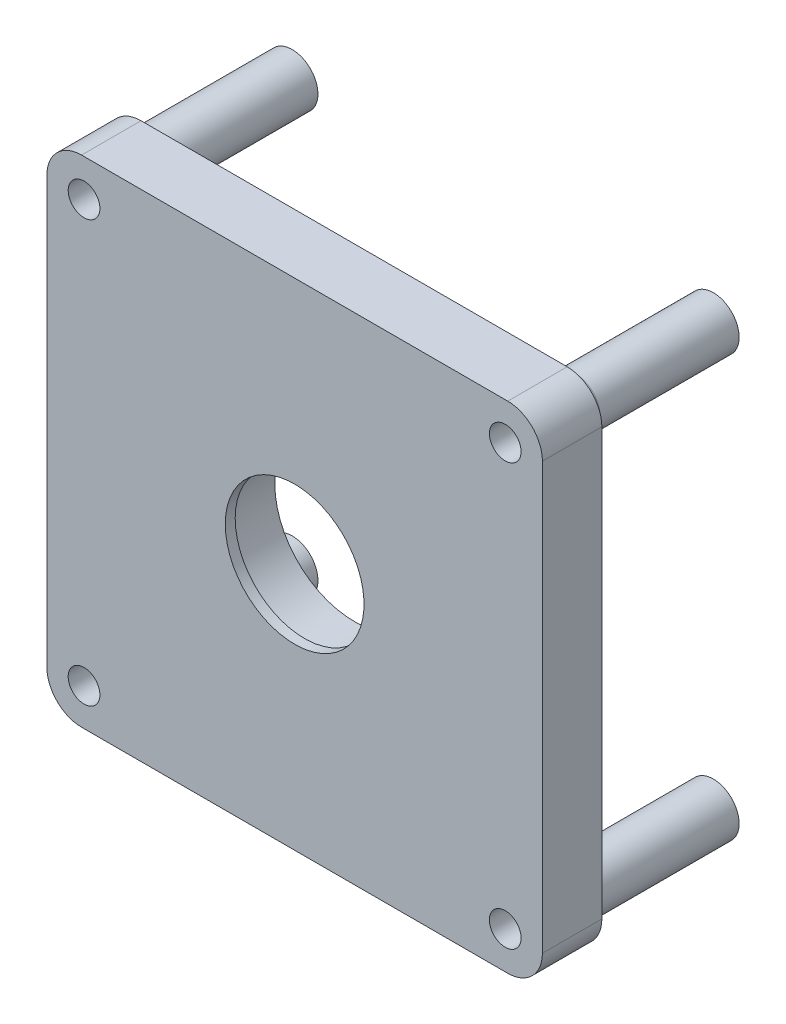
ISO-10303-21;
HEADER;
FILE_DESCRIPTION(('STEP AP214'),'2;1');
FILE_NAME('part.step','',(''),(''),'','','');
FILE_SCHEMA(('AUTOMOTIVE_DESIGN { 1 0 10303 214 1 1 1 1 }'));
ENDSEC;
DATA;
#1=APPLICATION_CONTEXT('core data for automotive mechanical design processes');
#2=APPLICATION_PROTOCOL_DEFINITION('international standard','automotive_design',2000,#1);
#3=PRODUCT_CONTEXT('',#1,'mechanical');
#4=PRODUCT('Part','Part','',(#3));
#5=PRODUCT_RELATED_PRODUCT_CATEGORY('part','',(#4));
#6=PRODUCT_DEFINITION_FORMATION('','',#4);
#7=PRODUCT_DEFINITION_CONTEXT('part definition',#1,'design');
#8=PRODUCT_DEFINITION('design','',#6,#7);
#9=PRODUCT_DEFINITION_SHAPE('','',#8);
#10=(LENGTH_UNIT() NAMED_UNIT(*) SI_UNIT(.MILLI.,.METRE.));
#11=(NAMED_UNIT(*) PLANE_ANGLE_UNIT() SI_UNIT($,.RADIAN.));
#12=(NAMED_UNIT(*) SI_UNIT($,.STERADIAN.) SOLID_ANGLE_UNIT());
#13=UNCERTAINTY_MEASURE_WITH_UNIT(LENGTH_MEASURE(1.E-05),#10,'distance_accuracy_value','');
#14=(GEOMETRIC_REPRESENTATION_CONTEXT(3) GLOBAL_UNCERTAINTY_ASSIGNED_CONTEXT((#13)) GLOBAL_UNIT_ASSIGNED_CONTEXT((#10,
#11,#12)) REPRESENTATION_CONTEXT('',''));
#15=CARTESIAN_POINT('',(0.,0.,0.));
#16=DIRECTION('',(0.,0.,1.));
#17=DIRECTION('',(1.,0.,0.));
#18=AXIS2_PLACEMENT_3D('',#15,#16,#17);
#19=CARTESIAN_POINT('',(0.,0.,0.));
#20=DIRECTION('',(0.,0.,-1.));
#21=DIRECTION('',(-1.,0.,0.));
#22=AXIS2_PLACEMENT_3D('',#19,#20,#21);
#23=PLANE('',#22);
#24=CARTESIAN_POINT('',(-42.5000000000001,42.4999999999999,0.));
#25=DIRECTION('',(0.,0.,-1.));
#26=DIRECTION('',(-1.,0.,0.));
#27=AXIS2_PLACEMENT_3D('',#24,#25,#26);
#28=CIRCLE('',#27,7.2);
#29=CARTESIAN_POINT('',(-49.7000000000001,42.4999999999999,0.));
#30=VERTEX_POINT('',#29);
#31=EDGE_CURVE('E153',#30,#30,#28,.F.);
#32=ORIENTED_EDGE('',*,*,#31,.T.);
#33=EDGE_LOOP('',(#32));
#34=FACE_BOUND('',#33,.T.);
#35=CARTESIAN_POINT('',(-42.5,-42.5,0.));
#36=DIRECTION('',(0.,0.,-1.));
#37=DIRECTION('',(-1.,0.,0.));
#38=AXIS2_PLACEMENT_3D('',#35,#36,#37);
#39=CIRCLE('',#38,7.2);
#40=CARTESIAN_POINT('',(-49.7,-42.5,0.));
#41=VERTEX_POINT('',#40);
#42=EDGE_CURVE('E150',#41,#41,#39,.F.);
#43=ORIENTED_EDGE('',*,*,#42,.T.);
#44=EDGE_LOOP('',(#43));
#45=FACE_BOUND('',#44,.T.);
#46=CARTESIAN_POINT('',(42.5000000000004,-42.4999999999996,0.));
#47=DIRECTION('',(0.,0.,-1.));
#48=DIRECTION('',(-1.,0.,0.));
#49=AXIS2_PLACEMENT_3D('',#46,#47,#48);
#50=CIRCLE('',#49,7.2);
#51=CARTESIAN_POINT('',(35.3000000000005,-42.4999999999996,0.));
#52=VERTEX_POINT('',#51);
#53=EDGE_CURVE('E147',#52,#52,#50,.F.);
#54=ORIENTED_EDGE('',*,*,#53,.T.);
#55=EDGE_LOOP('',(#54));
#56=FACE_BOUND('',#55,.T.);
#57=CARTESIAN_POINT('',(42.5,42.5,0.));
#58=DIRECTION('',(0.,0.,-1.));
#59=DIRECTION('',(-1.,0.,0.));
#60=AXIS2_PLACEMENT_3D('',#57,#58,#59);
#61=CIRCLE('',#60,7.2);
#62=CARTESIAN_POINT('',(35.3,42.5,0.));
#63=VERTEX_POINT('',#62);
#64=EDGE_CURVE('E144',#63,#63,#61,.F.);
#65=ORIENTED_EDGE('',*,*,#64,.T.);
#66=EDGE_LOOP('',(#65));
#67=FACE_BOUND('',#66,.T.);
#68=CARTESIAN_POINT('',(0.,0.,0.));
#69=DIRECTION('',(0.,0.,-1.));
#70=DIRECTION('',(-1.,0.,0.));
#71=AXIS2_PLACEMENT_3D('',#68,#69,#70);
#72=CIRCLE('',#71,16.);
#73=CARTESIAN_POINT('',(-16.,0.,0.));
#74=VERTEX_POINT('',#73);
#75=EDGE_CURVE('E197',#74,#74,#72,.T.);
#76=ORIENTED_EDGE('',*,*,#75,.F.);
#77=EDGE_LOOP('',(#76));
#78=FACE_BOUND('',#77,.T.);
#79=DIRECTION('',(1.,0.,0.));
#80=VECTOR('',#79,1.);
#81=CARTESIAN_POINT('',(-50.,-50.,0.));
#82=LINE('',#81,#80);
#83=CARTESIAN_POINT('',(-43.,-50.,0.));
#84=VERTEX_POINT('',#83);
#85=CARTESIAN_POINT('',(43.,-50.,0.));
#86=VERTEX_POINT('',#85);
#87=EDGE_CURVE('E119',#84,#86,#82,.T.);
#88=ORIENTED_EDGE('',*,*,#87,.F.);
#89=CARTESIAN_POINT('',(-43.,-43.,0.));
#90=DIRECTION('',(0.,0.,-1.));
#91=DIRECTION('',(-1.,0.,0.));
#92=AXIS2_PLACEMENT_3D('',#89,#90,#91);
#93=CIRCLE('',#92,7.);
#94=CARTESIAN_POINT('',(-50.,-43.,0.));
#95=VERTEX_POINT('',#94);
#96=EDGE_CURVE('E102',#84,#95,#93,.T.);
#97=ORIENTED_EDGE('',*,*,#96,.T.);
#98=DIRECTION('',(0.,-1.,0.));
#99=VECTOR('',#98,1.);
#100=CARTESIAN_POINT('',(-50.,-50.,0.));
#101=LINE('',#100,#99);
#102=CARTESIAN_POINT('',(-50.,43.,0.));
#103=VERTEX_POINT('',#102);
#104=EDGE_CURVE('E128',#103,#95,#101,.T.);
#105=ORIENTED_EDGE('',*,*,#104,.F.);
#106=CARTESIAN_POINT('',(-43.,43.,0.));
#107=DIRECTION('',(0.,0.,-1.));
#108=DIRECTION('',(-1.,0.,0.));
#109=AXIS2_PLACEMENT_3D('',#106,#107,#108);
#110=CIRCLE('',#109,7.);
#111=CARTESIAN_POINT('',(-43.,50.,0.));
#112=VERTEX_POINT('',#111);
#113=EDGE_CURVE('E123',#103,#112,#110,.T.);
#114=ORIENTED_EDGE('',*,*,#113,.T.);
#115=DIRECTION('',(-1.,0.,0.));
#116=VECTOR('',#115,1.);
#117=CARTESIAN_POINT('',(-50.,50.,0.));
#118=LINE('',#117,#116);
#119=CARTESIAN_POINT('',(43.,50.,0.));
#120=VERTEX_POINT('',#119);
#121=EDGE_CURVE('E132',#120,#112,#118,.T.);
#122=ORIENTED_EDGE('',*,*,#121,.F.);
#123=CARTESIAN_POINT('',(43.,43.,0.));
#124=DIRECTION('',(0.,0.,-1.));
#125=DIRECTION('',(-1.,0.,0.));
#126=AXIS2_PLACEMENT_3D('',#123,#124,#125);
#127=CIRCLE('',#126,7.);
#128=CARTESIAN_POINT('',(50.,43.,0.));
#129=VERTEX_POINT('',#128);
#130=EDGE_CURVE('E167',#120,#129,#127,.T.);
#131=ORIENTED_EDGE('',*,*,#130,.T.);
#132=DIRECTION('',(0.,1.,0.));
#133=VECTOR('',#132,1.);
#134=CARTESIAN_POINT('',(50.,-50.,0.));
#135=LINE('',#134,#133);
#136=CARTESIAN_POINT('',(50.,-43.,0.));
#137=VERTEX_POINT('',#136);
#138=EDGE_CURVE('E189',#137,#129,#135,.T.);
#139=ORIENTED_EDGE('',*,*,#138,.F.);
#140=CARTESIAN_POINT('',(43.,-43.,0.));
#141=DIRECTION('',(0.,0.,-1.));
#142=DIRECTION('',(-1.,0.,0.));
#143=AXIS2_PLACEMENT_3D('',#140,#141,#142);
#144=CIRCLE('',#143,7.);
#145=EDGE_CURVE('E113',#137,#86,#144,.T.);
#146=ORIENTED_EDGE('',*,*,#145,.T.);
#147=EDGE_LOOP('',(#88,#97,#105,#114,#122,#131,#139,#146));
#148=FACE_BOUND('',#147,.T.);
#149=ADVANCED_FACE('F36',(#34,#45,#56,#67,#78,#148),#23,.T.);
#150=CARTESIAN_POINT('',(50.,-50.,12.));
#151=DIRECTION('',(-1.,0.,0.));
#152=DIRECTION('',(0.,0.,1.));
#153=AXIS2_PLACEMENT_3D('',#150,#151,#152);
#154=PLANE('',#153);
#155=DIRECTION('',(0.,1.,0.));
#156=VECTOR('',#155,1.);
#157=CARTESIAN_POINT('',(50.,-50.,12.));
#158=LINE('',#157,#156);
#159=CARTESIAN_POINT('',(50.,-43.,12.));
#160=VERTEX_POINT('',#159);
#161=CARTESIAN_POINT('',(50.,43.,12.));
#162=VERTEX_POINT('',#161);
#163=EDGE_CURVE('E127',#160,#162,#158,.T.);
#164=ORIENTED_EDGE('',*,*,#163,.F.);
#165=DIRECTION('',(0.,0.,-1.));
#166=VECTOR('',#165,1.);
#167=CARTESIAN_POINT('',(50.,-43.,12.));
#168=LINE('',#167,#166);
#169=EDGE_CURVE('E182',#160,#137,#168,.T.);
#170=ORIENTED_EDGE('',*,*,#169,.T.);
#171=ORIENTED_EDGE('',*,*,#138,.T.);
#172=DIRECTION('',(0.,0.,-1.));
#173=VECTOR('',#172,1.);
#174=CARTESIAN_POINT('',(50.,43.,12.));
#175=LINE('',#174,#173);
#176=EDGE_CURVE('E180',#129,#162,#175,.F.);
#177=ORIENTED_EDGE('',*,*,#176,.T.);
#178=EDGE_LOOP('',(#164,#170,#171,#177));
#179=FACE_BOUND('',#178,.T.);
#180=ADVANCED_FACE('F188',(#179),#154,.F.);
#181=CARTESIAN_POINT('',(-50.,50.,12.));
#182=DIRECTION('',(0.,-1.,0.));
#183=DIRECTION('',(0.,0.,-1.));
#184=AXIS2_PLACEMENT_3D('',#181,#182,#183);
#185=PLANE('',#184);
#186=DIRECTION('',(-1.,0.,0.));
#187=VECTOR('',#186,1.);
#188=CARTESIAN_POINT('',(-50.,50.,12.));
#189=LINE('',#188,#187);
#190=CARTESIAN_POINT('',(43.,50.,12.));
#191=VERTEX_POINT('',#190);
#192=CARTESIAN_POINT('',(-43.,50.,12.));
#193=VERTEX_POINT('',#192);
#194=EDGE_CURVE('E130',#191,#193,#189,.T.);
#195=ORIENTED_EDGE('',*,*,#194,.F.);
#196=DIRECTION('',(0.,0.,-1.));
#197=VECTOR('',#196,1.);
#198=CARTESIAN_POINT('',(43.,50.,12.));
#199=LINE('',#198,#197);
#200=EDGE_CURVE('E11',#191,#120,#199,.T.);
#201=ORIENTED_EDGE('',*,*,#200,.T.);
#202=ORIENTED_EDGE('',*,*,#121,.T.);
#203=DIRECTION('',(0.,0.,-1.));
#204=VECTOR('',#203,1.);
#205=CARTESIAN_POINT('',(-43.,50.,12.));
#206=LINE('',#205,#204);
#207=EDGE_CURVE('E44',#112,#193,#206,.F.);
#208=ORIENTED_EDGE('',*,*,#207,.T.);
#209=EDGE_LOOP('',(#195,#201,#202,#208));
#210=FACE_BOUND('',#209,.T.);
#211=ADVANCED_FACE('F271',(#210),#185,.F.);
#212=CARTESIAN_POINT('',(-50.,-50.,12.));
#213=DIRECTION('',(1.,0.,0.));
#214=DIRECTION('',(0.,0.,-1.));
#215=AXIS2_PLACEMENT_3D('',#212,#213,#214);
#216=PLANE('',#215);
#217=ORIENTED_EDGE('',*,*,#104,.T.);
#218=DIRECTION('',(0.,0.,-1.));
#219=VECTOR('',#218,1.);
#220=CARTESIAN_POINT('',(-50.,-43.,12.));
#221=LINE('',#220,#219);
#222=CARTESIAN_POINT('',(-50.,-43.,12.));
#223=VERTEX_POINT('',#222);
#224=EDGE_CURVE('E107',#95,#223,#221,.F.);
#225=ORIENTED_EDGE('',*,*,#224,.T.);
#226=DIRECTION('',(0.,-1.,0.));
#227=VECTOR('',#226,1.);
#228=CARTESIAN_POINT('',(-50.,-50.,12.));
#229=LINE('',#228,#227);
#230=CARTESIAN_POINT('',(-50.,43.,12.));
#231=VERTEX_POINT('',#230);
#232=EDGE_CURVE('E201',#231,#223,#229,.T.);
#233=ORIENTED_EDGE('',*,*,#232,.F.);
#234=DIRECTION('',(0.,0.,-1.));
#235=VECTOR('',#234,1.);
#236=CARTESIAN_POINT('',(-50.,43.,12.));
#237=LINE('',#236,#235);
#238=EDGE_CURVE('E112',#231,#103,#237,.T.);
#239=ORIENTED_EDGE('',*,*,#238,.T.);
#240=EDGE_LOOP('',(#217,#225,#233,#239));
#241=FACE_BOUND('',#240,.T.);
#242=ADVANCED_FACE('F279',(#241),#216,.F.);
#243=CARTESIAN_POINT('',(-50.,-50.,12.));
#244=DIRECTION('',(0.,1.,0.));
#245=DIRECTION('',(0.,0.,1.));
#246=AXIS2_PLACEMENT_3D('',#243,#244,#245);
#247=PLANE('',#246);
#248=DIRECTION('',(1.,0.,0.));
#249=VECTOR('',#248,1.);
#250=CARTESIAN_POINT('',(-50.,-50.,12.));
#251=LINE('',#250,#249);
#252=CARTESIAN_POINT('',(-43.,-50.,12.));
#253=VERTEX_POINT('',#252);
#254=CARTESIAN_POINT('',(43.,-50.,12.));
#255=VERTEX_POINT('',#254);
#256=EDGE_CURVE('E122',#253,#255,#251,.T.);
#257=ORIENTED_EDGE('',*,*,#256,.F.);
#258=DIRECTION('',(0.,0.,-1.));
#259=VECTOR('',#258,1.);
#260=CARTESIAN_POINT('',(-43.,-50.,12.));
#261=LINE('',#260,#259);
#262=EDGE_CURVE('E106',#253,#84,#261,.T.);
#263=ORIENTED_EDGE('',*,*,#262,.T.);
#264=ORIENTED_EDGE('',*,*,#87,.T.);
#265=DIRECTION('',(0.,0.,-1.));
#266=VECTOR('',#265,1.);
#267=CARTESIAN_POINT('',(43.,-50.,12.));
#268=LINE('',#267,#266);
#269=EDGE_CURVE('E124',#86,#255,#268,.F.);
#270=ORIENTED_EDGE('',*,*,#269,.T.);
#271=EDGE_LOOP('',(#257,#263,#264,#270));
#272=FACE_BOUND('',#271,.T.);
#273=ADVANCED_FACE('F118',(#272),#247,.F.);
#274=CARTESIAN_POINT('',(0.,0.,12.));
#275=DIRECTION('',(0.,0.,-1.));
#276=DIRECTION('',(-1.,0.,0.));
#277=AXIS2_PLACEMENT_3D('',#274,#275,#276);
#278=PLANE('',#277);
#279=CARTESIAN_POINT('',(0.,0.,12.));
#280=DIRECTION('',(0.,0.,-1.));
#281=DIRECTION('',(-1.,0.,0.));
#282=AXIS2_PLACEMENT_3D('',#279,#280,#281);
#283=CIRCLE('',#282,14.);
#284=CARTESIAN_POINT('',(-14.,0.,12.));
#285=VERTEX_POINT('',#284);
#286=EDGE_CURVE('E140',#285,#285,#283,.T.);
#287=ORIENTED_EDGE('',*,*,#286,.T.);
#288=EDGE_LOOP('',(#287));
#289=FACE_BOUND('',#288,.T.);
#290=CARTESIAN_POINT('',(-42.5,42.5,12.));
#291=DIRECTION('',(0.,0.,1.));
#292=DIRECTION('',(1.,0.,0.));
#293=AXIS2_PLACEMENT_3D('',#290,#291,#292);
#294=CIRCLE('',#293,3.2);
#295=CARTESIAN_POINT('',(-39.3,42.5,12.));
#296=VERTEX_POINT('',#295);
#297=EDGE_CURVE('E216',#296,#296,#294,.T.);
#298=ORIENTED_EDGE('',*,*,#297,.F.);
#299=EDGE_LOOP('',(#298));
#300=FACE_BOUND('',#299,.T.);
#301=CARTESIAN_POINT('',(42.5,-42.5,12.));
#302=DIRECTION('',(0.,0.,1.));
#303=DIRECTION('',(1.,0.,0.));
#304=AXIS2_PLACEMENT_3D('',#301,#302,#303);
#305=CIRCLE('',#304,3.2);
#306=CARTESIAN_POINT('',(45.7,-42.5,12.));
#307=VERTEX_POINT('',#306);
#308=EDGE_CURVE('E213',#307,#307,#305,.T.);
#309=ORIENTED_EDGE('',*,*,#308,.F.);
#310=EDGE_LOOP('',(#309));
#311=FACE_BOUND('',#310,.T.);
#312=CARTESIAN_POINT('',(42.5,42.5,12.));
#313=DIRECTION('',(0.,0.,1.));
#314=DIRECTION('',(1.,0.,0.));
#315=AXIS2_PLACEMENT_3D('',#312,#313,#314);
#316=CIRCLE('',#315,3.2);
#317=CARTESIAN_POINT('',(45.7,42.5,12.));
#318=VERTEX_POINT('',#317);
#319=EDGE_CURVE('E210',#318,#318,#316,.T.);
#320=ORIENTED_EDGE('',*,*,#319,.F.);
#321=EDGE_LOOP('',(#320));
#322=FACE_BOUND('',#321,.T.);
#323=CARTESIAN_POINT('',(-42.5,-42.5,12.));
#324=DIRECTION('',(0.,0.,1.));
#325=DIRECTION('',(1.,0.,0.));
#326=AXIS2_PLACEMENT_3D('',#323,#324,#325);
#327=CIRCLE('',#326,3.2);
#328=CARTESIAN_POINT('',(-39.3,-42.5,12.));
#329=VERTEX_POINT('',#328);
#330=EDGE_CURVE('E206',#329,#329,#327,.T.);
#331=ORIENTED_EDGE('',*,*,#330,.F.);
#332=EDGE_LOOP('',(#331));
#333=FACE_BOUND('',#332,.T.);
#334=ORIENTED_EDGE('',*,*,#232,.T.);
#335=CARTESIAN_POINT('',(-43.,-43.,12.));
#336=DIRECTION('',(0.,0.,-1.));
#337=DIRECTION('',(-1.,0.,0.));
#338=AXIS2_PLACEMENT_3D('',#335,#336,#337);
#339=CIRCLE('',#338,7.);
#340=EDGE_CURVE('E178',#223,#253,#339,.F.);
#341=ORIENTED_EDGE('',*,*,#340,.T.);
#342=ORIENTED_EDGE('',*,*,#256,.T.);
#343=CARTESIAN_POINT('',(43.,-43.,12.));
#344=DIRECTION('',(0.,0.,-1.));
#345=DIRECTION('',(-1.,0.,0.));
#346=AXIS2_PLACEMENT_3D('',#343,#344,#345);
#347=CIRCLE('',#346,7.);
#348=EDGE_CURVE('E176',#255,#160,#347,.F.);
#349=ORIENTED_EDGE('',*,*,#348,.T.);
#350=ORIENTED_EDGE('',*,*,#163,.T.);
#351=CARTESIAN_POINT('',(43.,43.,12.));
#352=DIRECTION('',(0.,0.,-1.));
#353=DIRECTION('',(-1.,0.,0.));
#354=AXIS2_PLACEMENT_3D('',#351,#352,#353);
#355=CIRCLE('',#354,7.);
#356=EDGE_CURVE('E57',#162,#191,#355,.F.);
#357=ORIENTED_EDGE('',*,*,#356,.T.);
#358=ORIENTED_EDGE('',*,*,#194,.T.);
#359=CARTESIAN_POINT('',(-43.,43.,12.));
#360=DIRECTION('',(0.,0.,-1.));
#361=DIRECTION('',(-1.,0.,0.));
#362=AXIS2_PLACEMENT_3D('',#359,#360,#361);
#363=CIRCLE('',#362,7.);
#364=EDGE_CURVE('E173',#193,#231,#363,.F.);
#365=ORIENTED_EDGE('',*,*,#364,.T.);
#366=EDGE_LOOP('',(#334,#341,#342,#349,#350,#357,#358,#365));
#367=FACE_BOUND('',#366,.T.);
#368=ADVANCED_FACE('F245',(#289,#300,#311,#322,#333,#367),#278,.F.);
#369=CARTESIAN_POINT('',(0.,0.,10.));
#370=DIRECTION('',(0.,0.,-1.));
#371=DIRECTION('',(-1.,0.,0.));
#372=AXIS2_PLACEMENT_3D('',#369,#370,#371);
#373=CYLINDRICAL_SURFACE('',#372,16.);
#374=CARTESIAN_POINT('',(0.,0.,10.));
#375=DIRECTION('',(0.,0.,-1.));
#376=DIRECTION('',(-1.,0.,0.));
#377=AXIS2_PLACEMENT_3D('',#374,#375,#376);
#378=CIRCLE('',#377,16.);
#379=CARTESIAN_POINT('',(-16.,0.,10.));
#380=VERTEX_POINT('',#379);
#381=EDGE_CURVE('E194',#380,#380,#378,.T.);
#382=ORIENTED_EDGE('',*,*,#381,.F.);
#383=EDGE_LOOP('',(#382));
#384=FACE_BOUND('',#383,.T.);
#385=ORIENTED_EDGE('',*,*,#75,.T.);
#386=EDGE_LOOP('',(#385));
#387=FACE_BOUND('',#386,.T.);
#388=ADVANCED_FACE('F312',(#384,#387),#373,.F.);
#389=CARTESIAN_POINT('',(0.,0.,10.));
#390=DIRECTION('',(0.,0.,-1.));
#391=DIRECTION('',(-1.,0.,0.));
#392=AXIS2_PLACEMENT_3D('',#389,#390,#391);
#393=PLANE('',#392);
#394=CARTESIAN_POINT('',(0.,0.,10.));
#395=DIRECTION('',(0.,0.,-1.));
#396=DIRECTION('',(-1.,0.,0.));
#397=AXIS2_PLACEMENT_3D('',#394,#395,#396);
#398=CIRCLE('',#397,14.);
#399=CARTESIAN_POINT('',(-14.,0.,10.));
#400=VERTEX_POINT('',#399);
#401=EDGE_CURVE('E136',#400,#400,#398,.T.);
#402=ORIENTED_EDGE('',*,*,#401,.F.);
#403=EDGE_LOOP('',(#402));
#404=FACE_BOUND('',#403,.T.);
#405=ORIENTED_EDGE('',*,*,#381,.T.);
#406=EDGE_LOOP('',(#405));
#407=FACE_BOUND('',#406,.T.);
#408=ADVANCED_FACE('F316',(#404,#407),#393,.T.);
#409=CARTESIAN_POINT('',(-42.5,-42.5,12.));
#410=DIRECTION('',(0.,0.,1.));
#411=DIRECTION('',(1.,0.,0.));
#412=AXIS2_PLACEMENT_3D('',#409,#410,#411);
#413=CYLINDRICAL_SURFACE('',#412,3.2);
#414=ORIENTED_EDGE('',*,*,#330,.T.);
#415=EDGE_LOOP('',(#414));
#416=FACE_BOUND('',#415,.T.);
#417=CARTESIAN_POINT('',(-42.5,-42.5,-30.));
#418=DIRECTION('',(0.,0.,-1.));
#419=DIRECTION('',(1.,0.,0.));
#420=AXIS2_PLACEMENT_3D('',#417,#418,#419);
#421=CIRCLE('',#420,3.2);
#422=CARTESIAN_POINT('',(-39.3,-42.5,-30.));
#423=VERTEX_POINT('',#422);
#424=EDGE_CURVE('E234',#423,#423,#421,.T.);
#425=ORIENTED_EDGE('',*,*,#424,.T.);
#426=EDGE_LOOP('',(#425));
#427=FACE_BOUND('',#426,.T.);
#428=ADVANCED_FACE('F321',(#416,#427),#413,.F.);
#429=CARTESIAN_POINT('',(42.5,42.5,12.));
#430=DIRECTION('',(0.,0.,1.));
#431=DIRECTION('',(1.,0.,0.));
#432=AXIS2_PLACEMENT_3D('',#429,#430,#431);
#433=CYLINDRICAL_SURFACE('',#432,3.2);
#434=ORIENTED_EDGE('',*,*,#319,.T.);
#435=EDGE_LOOP('',(#434));
#436=FACE_BOUND('',#435,.T.);
#437=CARTESIAN_POINT('',(42.5,42.5,-30.));
#438=DIRECTION('',(0.,0.,-1.));
#439=DIRECTION('',(-1.,0.,0.));
#440=AXIS2_PLACEMENT_3D('',#437,#438,#439);
#441=CIRCLE('',#440,3.2);
#442=CARTESIAN_POINT('',(39.3,42.5,-30.));
#443=VERTEX_POINT('',#442);
#444=EDGE_CURVE('E222',#443,#443,#441,.T.);
#445=ORIENTED_EDGE('',*,*,#444,.T.);
#446=EDGE_LOOP('',(#445));
#447=FACE_BOUND('',#446,.T.);
#448=ADVANCED_FACE('F329',(#436,#447),#433,.F.);
#449=CARTESIAN_POINT('',(42.5,-42.5,12.));
#450=DIRECTION('',(0.,0.,1.));
#451=DIRECTION('',(1.,0.,0.));
#452=AXIS2_PLACEMENT_3D('',#449,#450,#451);
#453=CYLINDRICAL_SURFACE('',#452,3.2);
#454=ORIENTED_EDGE('',*,*,#308,.T.);
#455=EDGE_LOOP('',(#454));
#456=FACE_BOUND('',#455,.T.);
#457=CARTESIAN_POINT('',(42.5000000000004,-42.4999999999996,-30.));
#458=DIRECTION('',(0.,0.,-1.));
#459=DIRECTION('',(0.,1.,0.));
#460=AXIS2_PLACEMENT_3D('',#457,#458,#459);
#461=CIRCLE('',#460,3.2);
#462=CARTESIAN_POINT('',(42.5000000000004,-39.2999999999996,-30.));
#463=VERTEX_POINT('',#462);
#464=EDGE_CURVE('E139',#463,#463,#461,.T.);
#465=ORIENTED_EDGE('',*,*,#464,.T.);
#466=EDGE_LOOP('',(#465));
#467=FACE_BOUND('',#466,.T.);
#468=ADVANCED_FACE('F333',(#456,#467),#453,.F.);
#469=CARTESIAN_POINT('',(-42.5,42.5,12.));
#470=DIRECTION('',(0.,0.,1.));
#471=DIRECTION('',(1.,0.,0.));
#472=AXIS2_PLACEMENT_3D('',#469,#470,#471);
#473=CYLINDRICAL_SURFACE('',#472,3.2);
#474=ORIENTED_EDGE('',*,*,#297,.T.);
#475=EDGE_LOOP('',(#474));
#476=FACE_BOUND('',#475,.T.);
#477=CARTESIAN_POINT('',(-42.5000000000001,42.4999999999999,-30.));
#478=DIRECTION('',(0.,0.,-1.));
#479=DIRECTION('',(0.,-1.,0.));
#480=AXIS2_PLACEMENT_3D('',#477,#478,#479);
#481=CIRCLE('',#480,3.2);
#482=CARTESIAN_POINT('',(-42.5000000000001,39.2999999999999,-30.));
#483=VERTEX_POINT('',#482);
#484=EDGE_CURVE('E228',#483,#483,#481,.T.);
#485=ORIENTED_EDGE('',*,*,#484,.T.);
#486=EDGE_LOOP('',(#485));
#487=FACE_BOUND('',#486,.T.);
#488=ADVANCED_FACE('F337',(#476,#487),#473,.F.);
#489=CARTESIAN_POINT('',(42.5,42.5,-30.));
#490=DIRECTION('',(0.,0.,-1.));
#491=DIRECTION('',(-1.,0.,0.));
#492=AXIS2_PLACEMENT_3D('',#489,#490,#491);
#493=PLANE('',#492);
#494=CARTESIAN_POINT('',(42.5,42.5,-30.));
#495=DIRECTION('',(0.,0.,-1.));
#496=DIRECTION('',(-1.,0.,0.));
#497=AXIS2_PLACEMENT_3D('',#494,#495,#496);
#498=CIRCLE('',#497,5.2);
#499=CARTESIAN_POINT('',(37.3,42.5,-30.));
#500=VERTEX_POINT('',#499);
#501=EDGE_CURVE('E219',#500,#500,#498,.T.);
#502=ORIENTED_EDGE('',*,*,#501,.T.);
#503=EDGE_LOOP('',(#502));
#504=FACE_BOUND('',#503,.T.);
#505=ORIENTED_EDGE('',*,*,#444,.F.);
#506=EDGE_LOOP('',(#505));
#507=FACE_BOUND('',#506,.T.);
#508=ADVANCED_FACE('F341',(#504,#507),#493,.T.);
#509=CARTESIAN_POINT('',(42.5,42.5,-30.));
#510=DIRECTION('',(0.,0.,1.));
#511=DIRECTION('',(1.,0.,0.));
#512=AXIS2_PLACEMENT_3D('',#509,#510,#511);
#513=CYLINDRICAL_SURFACE('',#512,5.2);
#514=CARTESIAN_POINT('',(42.5,42.5,-2.));
#515=DIRECTION('',(0.,0.,-1.));
#516=DIRECTION('',(-1.,0.,0.));
#517=AXIS2_PLACEMENT_3D('',#514,#515,#516);
#518=CIRCLE('',#517,5.2);
#519=CARTESIAN_POINT('',(37.3,42.5,-2.));
#520=VERTEX_POINT('',#519);
#521=EDGE_CURVE('E162',#520,#520,#518,.T.);
#522=ORIENTED_EDGE('',*,*,#521,.T.);
#523=EDGE_LOOP('',(#522));
#524=FACE_BOUND('',#523,.T.);
#525=ORIENTED_EDGE('',*,*,#501,.F.);
#526=EDGE_LOOP('',(#525));
#527=FACE_BOUND('',#526,.T.);
#528=ADVANCED_FACE('F343',(#524,#527),#513,.T.);
#529=CARTESIAN_POINT('',(-42.5000000000001,42.4999999999999,-30.));
#530=DIRECTION('',(0.,0.,-1.));
#531=DIRECTION('',(0.,-1.,0.));
#532=AXIS2_PLACEMENT_3D('',#529,#530,#531);
#533=PLANE('',#532);
#534=CARTESIAN_POINT('',(-42.5000000000001,42.4999999999999,-30.));
#535=DIRECTION('',(0.,0.,-1.));
#536=DIRECTION('',(0.,-1.,0.));
#537=AXIS2_PLACEMENT_3D('',#534,#535,#536);
#538=CIRCLE('',#537,5.2);
#539=CARTESIAN_POINT('',(-42.5000000000001,37.2999999999999,-30.));
#540=VERTEX_POINT('',#539);
#541=EDGE_CURVE('E225',#540,#540,#538,.T.);
#542=ORIENTED_EDGE('',*,*,#541,.T.);
#543=EDGE_LOOP('',(#542));
#544=FACE_BOUND('',#543,.T.);
#545=ORIENTED_EDGE('',*,*,#484,.F.);
#546=EDGE_LOOP('',(#545));
#547=FACE_BOUND('',#546,.T.);
#548=ADVANCED_FACE('F346',(#544,#547),#533,.T.);
#549=CARTESIAN_POINT('',(-42.5000000000001,42.4999999999999,-30.));
#550=DIRECTION('',(0.,0.,1.));
#551=DIRECTION('',(1.,0.,0.));
#552=AXIS2_PLACEMENT_3D('',#549,#550,#551);
#553=CYLINDRICAL_SURFACE('',#552,5.2);
#554=CARTESIAN_POINT('',(-42.5000000000001,42.4999999999999,-2.));
#555=DIRECTION('',(0.,0.,-1.));
#556=DIRECTION('',(-1.,0.,0.));
#557=AXIS2_PLACEMENT_3D('',#554,#555,#556);
#558=CIRCLE('',#557,5.2);
#559=CARTESIAN_POINT('',(-47.7000000000001,42.4999999999999,-2.));
#560=VERTEX_POINT('',#559);
#561=EDGE_CURVE('E141',#560,#560,#558,.T.);
#562=ORIENTED_EDGE('',*,*,#561,.T.);
#563=EDGE_LOOP('',(#562));
#564=FACE_BOUND('',#563,.T.);
#565=ORIENTED_EDGE('',*,*,#541,.F.);
#566=EDGE_LOOP('',(#565));
#567=FACE_BOUND('',#566,.T.);
#568=ADVANCED_FACE('F351',(#564,#567),#553,.T.);
#569=CARTESIAN_POINT('',(-42.5,-42.5,-30.));
#570=DIRECTION('',(0.,0.,-1.));
#571=DIRECTION('',(1.,0.,0.));
#572=AXIS2_PLACEMENT_3D('',#569,#570,#571);
#573=PLANE('',#572);
#574=CARTESIAN_POINT('',(-42.5,-42.5,-30.));
#575=DIRECTION('',(0.,0.,-1.));
#576=DIRECTION('',(1.,0.,0.));
#577=AXIS2_PLACEMENT_3D('',#574,#575,#576);
#578=CIRCLE('',#577,5.2);
#579=CARTESIAN_POINT('',(-37.3,-42.5,-30.));
#580=VERTEX_POINT('',#579);
#581=EDGE_CURVE('E231',#580,#580,#578,.T.);
#582=ORIENTED_EDGE('',*,*,#581,.T.);
#583=EDGE_LOOP('',(#582));
#584=FACE_BOUND('',#583,.T.);
#585=ORIENTED_EDGE('',*,*,#424,.F.);
#586=EDGE_LOOP('',(#585));
#587=FACE_BOUND('',#586,.T.);
#588=ADVANCED_FACE('F354',(#584,#587),#573,.T.);
#589=CARTESIAN_POINT('',(-42.5,-42.5,-30.));
#590=DIRECTION('',(0.,0.,1.));
#591=DIRECTION('',(1.,0.,0.));
#592=AXIS2_PLACEMENT_3D('',#589,#590,#591);
#593=CYLINDRICAL_SURFACE('',#592,5.2);
#594=CARTESIAN_POINT('',(-42.5,-42.5,-2.));
#595=DIRECTION('',(0.,0.,-1.));
#596=DIRECTION('',(-1.,0.,0.));
#597=AXIS2_PLACEMENT_3D('',#594,#595,#596);
#598=CIRCLE('',#597,5.2);
#599=CARTESIAN_POINT('',(-47.7,-42.5,-2.));
#600=VERTEX_POINT('',#599);
#601=EDGE_CURVE('E156',#600,#600,#598,.T.);
#602=ORIENTED_EDGE('',*,*,#601,.T.);
#603=EDGE_LOOP('',(#602));
#604=FACE_BOUND('',#603,.T.);
#605=ORIENTED_EDGE('',*,*,#581,.F.);
#606=EDGE_LOOP('',(#605));
#607=FACE_BOUND('',#606,.T.);
#608=ADVANCED_FACE('F359',(#604,#607),#593,.T.);
#609=CARTESIAN_POINT('',(42.5000000000004,-42.4999999999996,-30.));
#610=DIRECTION('',(0.,0.,-1.));
#611=DIRECTION('',(0.,1.,0.));
#612=AXIS2_PLACEMENT_3D('',#609,#610,#611);
#613=PLANE('',#612);
#614=CARTESIAN_POINT('',(42.5000000000004,-42.4999999999996,-30.));
#615=DIRECTION('',(0.,0.,-1.));
#616=DIRECTION('',(0.,1.,0.));
#617=AXIS2_PLACEMENT_3D('',#614,#615,#616);
#618=CIRCLE('',#617,5.2);
#619=CARTESIAN_POINT('',(42.5000000000004,-37.2999999999996,-30.));
#620=VERTEX_POINT('',#619);
#621=EDGE_CURVE('E237',#620,#620,#618,.T.);
#622=ORIENTED_EDGE('',*,*,#621,.T.);
#623=EDGE_LOOP('',(#622));
#624=FACE_BOUND('',#623,.T.);
#625=ORIENTED_EDGE('',*,*,#464,.F.);
#626=EDGE_LOOP('',(#625));
#627=FACE_BOUND('',#626,.T.);
#628=ADVANCED_FACE('F261',(#624,#627),#613,.T.);
#629=CARTESIAN_POINT('',(42.5000000000004,-42.4999999999996,-30.));
#630=DIRECTION('',(0.,0.,1.));
#631=DIRECTION('',(1.,0.,0.));
#632=AXIS2_PLACEMENT_3D('',#629,#630,#631);
#633=CYLINDRICAL_SURFACE('',#632,5.2);
#634=CARTESIAN_POINT('',(42.5000000000004,-42.4999999999996,-2.));
#635=DIRECTION('',(0.,0.,-1.));
#636=DIRECTION('',(-1.,0.,0.));
#637=AXIS2_PLACEMENT_3D('',#634,#635,#636);
#638=CIRCLE('',#637,5.2);
#639=CARTESIAN_POINT('',(37.3000000000005,-42.4999999999996,-2.));
#640=VERTEX_POINT('',#639);
#641=EDGE_CURVE('E159',#640,#640,#638,.T.);
#642=ORIENTED_EDGE('',*,*,#641,.T.);
#643=EDGE_LOOP('',(#642));
#644=FACE_BOUND('',#643,.T.);
#645=ORIENTED_EDGE('',*,*,#621,.F.);
#646=EDGE_LOOP('',(#645));
#647=FACE_BOUND('',#646,.T.);
#648=ADVANCED_FACE('F251',(#644,#647),#633,.T.);
#649=CARTESIAN_POINT('',(0.,0.,12.));
#650=DIRECTION('',(0.,0.,-1.));
#651=DIRECTION('',(-1.,0.,0.));
#652=AXIS2_PLACEMENT_3D('',#649,#650,#651);
#653=CYLINDRICAL_SURFACE('',#652,14.);
#654=ORIENTED_EDGE('',*,*,#401,.T.);
#655=EDGE_LOOP('',(#654));
#656=FACE_BOUND('',#655,.T.);
#657=ORIENTED_EDGE('',*,*,#286,.F.);
#658=EDGE_LOOP('',(#657));
#659=FACE_BOUND('',#658,.T.);
#660=ADVANCED_FACE('F248',(#656,#659),#653,.F.);
#661=CARTESIAN_POINT('',(-42.5000000000001,42.4999999999999,-2.));
#662=DIRECTION('',(0.,0.,-1.));
#663=DIRECTION('',(-1.,0.,0.));
#664=AXIS2_PLACEMENT_3D('',#661,#662,#663);
#665=TOROIDAL_SURFACE('',#664,7.2,2.);
#666=ORIENTED_EDGE('',*,*,#31,.F.);
#667=EDGE_LOOP('',(#666));
#668=FACE_BOUND('',#667,.T.);
#669=ORIENTED_EDGE('',*,*,#561,.F.);
#670=EDGE_LOOP('',(#669));
#671=FACE_BOUND('',#670,.T.);
#672=ADVANCED_FACE('F250',(#668,#671),#665,.F.);
#673=CARTESIAN_POINT('',(-42.5,-42.5,-2.));
#674=DIRECTION('',(0.,0.,-1.));
#675=DIRECTION('',(-1.,0.,0.));
#676=AXIS2_PLACEMENT_3D('',#673,#674,#675);
#677=TOROIDAL_SURFACE('',#676,7.2,2.);
#678=ORIENTED_EDGE('',*,*,#42,.F.);
#679=EDGE_LOOP('',(#678));
#680=FACE_BOUND('',#679,.T.);
#681=ORIENTED_EDGE('',*,*,#601,.F.);
#682=EDGE_LOOP('',(#681));
#683=FACE_BOUND('',#682,.T.);
#684=ADVANCED_FACE('F258',(#680,#683),#677,.F.);
#685=CARTESIAN_POINT('',(42.5000000000004,-42.4999999999996,-2.));
#686=DIRECTION('',(0.,0.,-1.));
#687=DIRECTION('',(-1.,0.,0.));
#688=AXIS2_PLACEMENT_3D('',#685,#686,#687);
#689=TOROIDAL_SURFACE('',#688,7.2,2.);
#690=ORIENTED_EDGE('',*,*,#53,.F.);
#691=EDGE_LOOP('',(#690));
#692=FACE_BOUND('',#691,.T.);
#693=ORIENTED_EDGE('',*,*,#641,.F.);
#694=EDGE_LOOP('',(#693));
#695=FACE_BOUND('',#694,.T.);
#696=ADVANCED_FACE('F287',(#692,#695),#689,.F.);
#697=CARTESIAN_POINT('',(42.5,42.5,-2.));
#698=DIRECTION('',(0.,0.,-1.));
#699=DIRECTION('',(-1.,0.,0.));
#700=AXIS2_PLACEMENT_3D('',#697,#698,#699);
#701=TOROIDAL_SURFACE('',#700,7.2,2.);
#702=ORIENTED_EDGE('',*,*,#64,.F.);
#703=EDGE_LOOP('',(#702));
#704=FACE_BOUND('',#703,.T.);
#705=ORIENTED_EDGE('',*,*,#521,.F.);
#706=EDGE_LOOP('',(#705));
#707=FACE_BOUND('',#706,.T.);
#708=ADVANCED_FACE('F291',(#704,#707),#701,.F.);
#709=CARTESIAN_POINT('',(-43.,-43.,12.));
#710=DIRECTION('',(0.,0.,-1.));
#711=DIRECTION('',(-1.,0.,0.));
#712=AXIS2_PLACEMENT_3D('',#709,#710,#711);
#713=CYLINDRICAL_SURFACE('',#712,7.);
#714=ORIENTED_EDGE('',*,*,#340,.F.);
#715=ORIENTED_EDGE('',*,*,#224,.F.);
#716=ORIENTED_EDGE('',*,*,#96,.F.);
#717=ORIENTED_EDGE('',*,*,#262,.F.);
#718=EDGE_LOOP('',(#714,#715,#716,#717));
#719=FACE_BOUND('',#718,.T.);
#720=ADVANCED_FACE('F105',(#719),#713,.T.);
#721=CARTESIAN_POINT('',(43.,-43.,12.));
#722=DIRECTION('',(0.,0.,-1.));
#723=DIRECTION('',(-1.,0.,0.));
#724=AXIS2_PLACEMENT_3D('',#721,#722,#723);
#725=CYLINDRICAL_SURFACE('',#724,7.);
#726=ORIENTED_EDGE('',*,*,#348,.F.);
#727=ORIENTED_EDGE('',*,*,#269,.F.);
#728=ORIENTED_EDGE('',*,*,#145,.F.);
#729=ORIENTED_EDGE('',*,*,#169,.F.);
#730=EDGE_LOOP('',(#726,#727,#728,#729));
#731=FACE_BOUND('',#730,.T.);
#732=ADVANCED_FACE('F298',(#731),#725,.T.);
#733=CARTESIAN_POINT('',(43.,43.,12.));
#734=DIRECTION('',(0.,0.,-1.));
#735=DIRECTION('',(-1.,0.,0.));
#736=AXIS2_PLACEMENT_3D('',#733,#734,#735);
#737=CYLINDRICAL_SURFACE('',#736,7.);
#738=ORIENTED_EDGE('',*,*,#356,.F.);
#739=ORIENTED_EDGE('',*,*,#176,.F.);
#740=ORIENTED_EDGE('',*,*,#130,.F.);
#741=ORIENTED_EDGE('',*,*,#200,.F.);
#742=EDGE_LOOP('',(#738,#739,#740,#741));
#743=FACE_BOUND('',#742,.T.);
#744=ADVANCED_FACE('F300',(#743),#737,.T.);
#745=CARTESIAN_POINT('',(-43.,43.,12.));
#746=DIRECTION('',(0.,0.,-1.));
#747=DIRECTION('',(-1.,0.,0.));
#748=AXIS2_PLACEMENT_3D('',#745,#746,#747);
#749=CYLINDRICAL_SURFACE('',#748,7.);
#750=ORIENTED_EDGE('',*,*,#364,.F.);
#751=ORIENTED_EDGE('',*,*,#207,.F.);
#752=ORIENTED_EDGE('',*,*,#113,.F.);
#753=ORIENTED_EDGE('',*,*,#238,.F.);
#754=EDGE_LOOP('',(#750,#751,#752,#753));
#755=FACE_BOUND('',#754,.T.);
#756=ADVANCED_FACE('F38',(#755),#749,.T.);
#757=CLOSED_SHELL('',(#149,#180,#211,#242,#273,#368,#388,#408,#428,#448,#468,#488,#508,#528,
#548,#568,#588,#608,#628,#648,#660,#672,#684,#696,#708,#720,#732,#744,#756));
#758=MANIFOLD_SOLID_BREP('B2',#757);
#759=ADVANCED_BREP_SHAPE_REPRESENTATION('',(#18,#758),#14);
#760=SHAPE_DEFINITION_REPRESENTATION(#9,#759);
ENDSEC;
END-ISO-10303-21;
